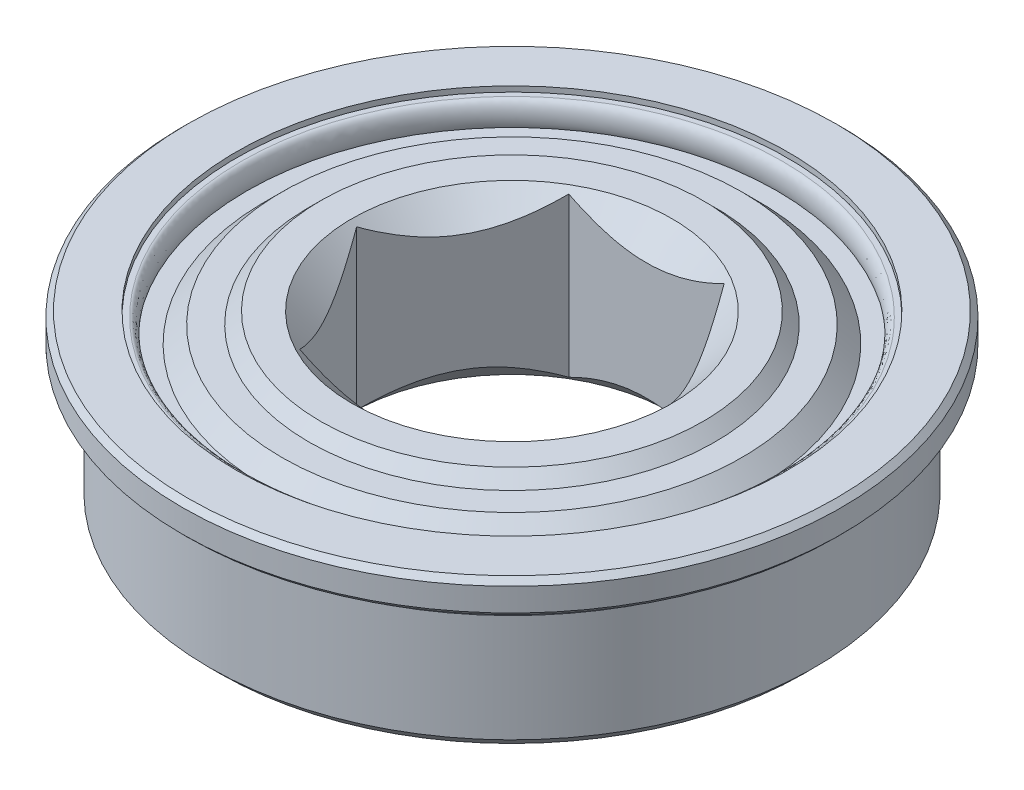
ISO-10303-21;
HEADER;
FILE_DESCRIPTION(('STEP AP214'),'2;1');
FILE_NAME('part.step','',(''),(''),'','','');
FILE_SCHEMA(('AUTOMOTIVE_DESIGN { 1 0 10303 214 1 1 1 1 }'));
ENDSEC;
DATA;
#1=APPLICATION_CONTEXT('core data for automotive mechanical design processes');
#2=APPLICATION_PROTOCOL_DEFINITION('international standard','automotive_design',2000,#1);
#3=PRODUCT_CONTEXT('',#1,'mechanical');
#4=PRODUCT('Part','Part','',(#3));
#5=PRODUCT_RELATED_PRODUCT_CATEGORY('part','',(#4));
#6=PRODUCT_DEFINITION_FORMATION('','',#4);
#7=PRODUCT_DEFINITION_CONTEXT('part definition',#1,'design');
#8=PRODUCT_DEFINITION('design','',#6,#7);
#9=PRODUCT_DEFINITION_SHAPE('','',#8);
#10=(LENGTH_UNIT() NAMED_UNIT(*) SI_UNIT(.MILLI.,.METRE.));
#11=(NAMED_UNIT(*) PLANE_ANGLE_UNIT() SI_UNIT($,.RADIAN.));
#12=(NAMED_UNIT(*) SI_UNIT($,.STERADIAN.) SOLID_ANGLE_UNIT());
#13=UNCERTAINTY_MEASURE_WITH_UNIT(LENGTH_MEASURE(1.E-05),#10,'distance_accuracy_value','');
#14=(GEOMETRIC_REPRESENTATION_CONTEXT(3) GLOBAL_UNCERTAINTY_ASSIGNED_CONTEXT((#13)) GLOBAL_UNIT_ASSIGNED_CONTEXT((#10,
#11,#12)) REPRESENTATION_CONTEXT('',''));
#15=CARTESIAN_POINT('',(0.,0.,0.));
#16=DIRECTION('',(0.,0.,1.));
#17=DIRECTION('',(1.,0.,0.));
#18=AXIS2_PLACEMENT_3D('',#15,#16,#17);
#19=CARTESIAN_POINT('',(0.,-1.7272,0.));
#20=DIRECTION('',(0.,-1.,0.));
#21=DIRECTION('',(0.,0.,-1.));
#22=AXIS2_PLACEMENT_3D('',#19,#20,#21);
#23=TOROIDAL_SURFACE('',#22,14.224,0.127);
#24=CARTESIAN_POINT('',(0.,-1.7272,0.));
#25=DIRECTION('',(0.,-1.,0.));
#26=DIRECTION('',(0.,0.,-1.));
#27=AXIS2_PLACEMENT_3D('',#24,#25,#26);
#28=CIRCLE('',#27,14.097);
#29=CARTESIAN_POINT('',(0.,-1.7272,-14.097));
#30=VERTEX_POINT('',#29);
#31=EDGE_CURVE('E424',#30,#30,#28,.T.);
#32=ORIENTED_EDGE('',*,*,#31,.F.);
#33=EDGE_LOOP('',(#32));
#34=FACE_BOUND('',#33,.T.);
#35=CARTESIAN_POINT('',(0.,-1.6002,0.));
#36=DIRECTION('',(0.,1.,0.));
#37=DIRECTION('',(0.,0.,-1.));
#38=AXIS2_PLACEMENT_3D('',#35,#36,#37);
#39=CIRCLE('',#38,14.224);
#40=CARTESIAN_POINT('',(0.,-1.6002,-14.224));
#41=VERTEX_POINT('',#40);
#42=EDGE_CURVE('E423',#41,#41,#39,.T.);
#43=ORIENTED_EDGE('',*,*,#42,.F.);
#44=EDGE_LOOP('',(#43));
#45=FACE_BOUND('',#44,.T.);
#46=ADVANCED_FACE('F16',(#34,#45),#23,.F.);
#47=CARTESIAN_POINT('',(7.33234841870825,-7.9375,0.));
#48=DIRECTION('',(0.866025403784439,0.,-0.5));
#49=DIRECTION('',(0.,-1.,0.));
#50=AXIS2_PLACEMENT_3D('',#47,#48,#49);
#51=PLANE('',#50);
#52=CARTESIAN_POINT('',(7.33234841870825,-0.22415158129175,0.));
#53=CARTESIAN_POINT('',(6.86885874856062,-0.68764125143938,-0.802787657479035));
#54=CARTESIAN_POINT('',(6.44960705918636,-0.928142123320571,-1.52895288463434));
#55=CARTESIAN_POINT('',(5.96795144312518,-1.20444058208666,-2.36320488340318));
#56=CARTESIAN_POINT('',(5.50600984993854,-1.2064856558471,-3.16331119293176));
#57=CARTESIAN_POINT('',(5.04374558814999,-1.20853215810218,-3.96397638087285));
#58=CARTESIAN_POINT('',(4.5611815986816,-0.935135019167009,-4.79980172853524));
#59=CARTESIAN_POINT('',(4.13662420852037,-0.694601580458219,-5.53515669902333));
#60=CARTESIAN_POINT('',(3.66617420935412,-0.224151581291739,-6.35000000000001));
#61=B_SPLINE_CURVE_WITH_KNOTS('',2,(#52,#53,#54,#55,#56,#57,#58,#59,#60),.UNSPECIFIED.,.F.,.F.,
(3,2,2,2,3),(0.,0.25,0.5,0.75,1.),.UNSPECIFIED.);
#62=CARTESIAN_POINT('',(7.33234841870825,-0.224151581291754,0.));
#63=VERTEX_POINT('',#62);
#64=CARTESIAN_POINT('',(3.66617420935412,-0.224151581291751,-6.35));
#65=VERTEX_POINT('',#64);
#66=EDGE_CURVE('E207',#63,#65,#61,.T.);
#67=ORIENTED_EDGE('',*,*,#66,.T.);
#68=DIRECTION('',(0.,1.,0.));
#69=VECTOR('',#68,1.);
#70=CARTESIAN_POINT('',(3.66617420935412,-7.9375,-6.35));
#71=LINE('',#70,#69);
#72=CARTESIAN_POINT('',(3.66617420935412,-7.71334841870825,-6.35));
#73=VERTEX_POINT('',#72);
#74=EDGE_CURVE('E11',#73,#65,#71,.T.);
#75=ORIENTED_EDGE('',*,*,#74,.F.);
#76=CARTESIAN_POINT('',(3.66617420935412,-7.71334841870824,-6.35000000000001));
#77=CARTESIAN_POINT('',(4.12966387950616,-7.24985874855621,-5.54721234251334));
#78=CARTESIAN_POINT('',(4.54891556887601,-7.00935787667942,-4.82104711536568));
#79=CARTESIAN_POINT('',(5.03057118494097,-6.73305941791331,-3.98679511659028));
#80=CARTESIAN_POINT('',(5.49251277812383,-6.73101434415289,-3.18668880706825));
#81=CARTESIAN_POINT('',(5.95477703991218,-6.72896784189781,-2.38602361912751));
#82=CARTESIAN_POINT('',(6.43734102938077,-7.00236498083298,-1.55019827146477));
#83=CARTESIAN_POINT('',(6.86189841954177,-7.24289841954153,-0.814843300977084));
#84=CARTESIAN_POINT('',(7.33234841870825,-7.71334841870824,0.));
#85=B_SPLINE_CURVE_WITH_KNOTS('',2,(#76,#77,#78,#79,#80,#81,#82,#83,#84),.UNSPECIFIED.,.F.,.F.,
(3,2,2,2,3),(0.,0.25,0.5,0.75,1.),.UNSPECIFIED.);
#86=CARTESIAN_POINT('',(7.33234841870825,-7.71334841870825,0.));
#87=VERTEX_POINT('',#86);
#88=EDGE_CURVE('E370',#73,#87,#85,.T.);
#89=ORIENTED_EDGE('',*,*,#88,.T.);
#90=DIRECTION('',(0.,1.,0.));
#91=VECTOR('',#90,1.);
#92=CARTESIAN_POINT('',(7.33234841870825,-7.9375,0.));
#93=LINE('',#92,#91);
#94=EDGE_CURVE('E188',#87,#63,#93,.T.);
#95=ORIENTED_EDGE('',*,*,#94,.T.);
#96=EDGE_LOOP('',(#67,#75,#89,#95));
#97=FACE_BOUND('',#96,.T.);
#98=ADVANCED_FACE('F615',(#97),#51,.F.);
#99=CARTESIAN_POINT('',(3.66617420935412,-7.9375,-6.35));
#100=DIRECTION('',(0.,0.,-1.));
#101=DIRECTION('',(-1.,0.,0.));
#102=AXIS2_PLACEMENT_3D('',#99,#100,#101);
#103=PLANE('',#102);
#104=CARTESIAN_POINT('',(3.66617420935412,-0.22415158129174,-6.35));
#105=CARTESIAN_POINT('',(2.73227432110119,-0.69110152541821,-6.35));
#106=CARTESIAN_POINT('',(1.88795550411408,-0.93178295053179,-6.35));
#107=CARTESIAN_POINT('',(0.925627723468545,-1.20610399728834,-6.35));
#108=CARTESIAN_POINT('',(0.00216765710562509,-1.20649963002069,-6.35));
#109=CARTESIAN_POINT('',(-0.92177943687831,-1.20689547140752,-6.35));
#110=CARTESIAN_POINT('',(-1.8867218260932,-0.93213442667476,-6.35));
#111=CARTESIAN_POINT('',(-2.7310323176977,-0.69172252711998,-6.35));
#112=CARTESIAN_POINT('',(-3.66617420935413,-0.22415158129174,-6.35));
#113=B_SPLINE_CURVE_WITH_KNOTS('',2,(#104,#105,#106,#107,#108,#109,#110,#111,#112),
.UNSPECIFIED.,.F.,.F.,(3,2,2,2,3),(0.,0.25,0.5,0.75,1.),.UNSPECIFIED.);
#114=CARTESIAN_POINT('',(-3.66617420935413,-0.224151581291746,-6.35));
#115=VERTEX_POINT('',#114);
#116=EDGE_CURVE('E564',#65,#115,#113,.T.);
#117=ORIENTED_EDGE('',*,*,#116,.T.);
#118=DIRECTION('',(0.,1.,0.));
#119=VECTOR('',#118,1.);
#120=CARTESIAN_POINT('',(-3.66617420935413,-7.9375,-6.35));
#121=LINE('',#120,#119);
#122=CARTESIAN_POINT('',(-3.66617420935413,-7.71334841870826,-6.35));
#123=VERTEX_POINT('',#122);
#124=EDGE_CURVE('E29',#123,#115,#121,.T.);
#125=ORIENTED_EDGE('',*,*,#124,.F.);
#126=CARTESIAN_POINT('',(-3.66617420935413,-7.71334841870825,-6.35));
#127=CARTESIAN_POINT('',(-2.73160048914318,-7.24606155860275,-6.35));
#128=CARTESIAN_POINT('',(-1.8867218260932,-7.00536557332522,-6.35));
#129=CARTESIAN_POINT('',(-0.9228354387176,-6.73076568833412,-6.35));
#130=CARTESIAN_POINT('',(0.00216765710562986,-6.73100036997929,-6.35));
#131=CARTESIAN_POINT('',(0.92456619557612,-6.73123439082472,-6.35));
#132=CARTESIAN_POINT('',(1.88795550411408,-7.0057170494682,-6.35));
#133=CARTESIAN_POINT('',(2.73169984620938,-7.24611123713587,-6.35));
#134=CARTESIAN_POINT('',(3.66617420935412,-7.71334841870824,-6.35));
#135=B_SPLINE_CURVE_WITH_KNOTS('',2,(#126,#127,#128,#129,#130,#131,#132,#133,#134),
.UNSPECIFIED.,.F.,.F.,(3,2,2,2,3),(0.,0.25,0.5,0.75,1.),.UNSPECIFIED.);
#136=EDGE_CURVE('E378',#123,#73,#135,.T.);
#137=ORIENTED_EDGE('',*,*,#136,.T.);
#138=ORIENTED_EDGE('',*,*,#74,.T.);
#139=EDGE_LOOP('',(#117,#125,#137,#138));
#140=FACE_BOUND('',#139,.T.);
#141=ADVANCED_FACE('F476',(#140),#103,.F.);
#142=CARTESIAN_POINT('',(-3.66617420935413,-7.9375,-6.35));
#143=DIRECTION('',(-0.866025403784439,0.,-0.5));
#144=DIRECTION('',(-0.5,0.,0.866025403784439));
#145=AXIS2_PLACEMENT_3D('',#142,#143,#144);
#146=PLANE('',#145);
#147=CARTESIAN_POINT('',(-3.66617420935413,-0.224151581291737,-6.35));
#148=CARTESIAN_POINT('',(-4.12966387950116,-0.687641251438776,-5.54721234252199));
#149=CARTESIAN_POINT('',(-4.54891556887602,-0.928142123320557,-4.82104711536567));
#150=CARTESIAN_POINT('',(-5.03057118493667,-1.20444058208665,-3.98679511659772));
#151=CARTESIAN_POINT('',(-5.49251277812383,-1.20648565584709,-3.18668880706824));
#152=CARTESIAN_POINT('',(-5.95477703991238,-1.20853215810217,-2.38602361912716));
#153=CARTESIAN_POINT('',(-6.43734102938078,-0.935135019166996,-1.55019827146476));
#154=CARTESIAN_POINT('',(-6.861898419542,-0.694601580458217,-0.814843300976677));
#155=CARTESIAN_POINT('',(-7.33234841870825,-0.224151581291737,0.));
#156=B_SPLINE_CURVE_WITH_KNOTS('',2,(#147,#148,#149,#150,#151,#152,#153,#154,#155),
.UNSPECIFIED.,.F.,.F.,(3,2,2,2,3),(0.,0.25,0.5,0.75,1.),.UNSPECIFIED.);
#157=CARTESIAN_POINT('',(-7.33234841870825,-0.224151581291749,0.));
#158=VERTEX_POINT('',#157);
#159=EDGE_CURVE('E559',#115,#158,#156,.T.);
#160=ORIENTED_EDGE('',*,*,#159,.T.);
#161=DIRECTION('',(0.,1.,0.));
#162=VECTOR('',#161,1.);
#163=CARTESIAN_POINT('',(-7.33234841870825,-7.9375,0.));
#164=LINE('',#163,#162);
#165=CARTESIAN_POINT('',(-7.33234841870825,-7.71334841870825,0.));
#166=VERTEX_POINT('',#165);
#167=EDGE_CURVE('E305',#166,#158,#164,.T.);
#168=ORIENTED_EDGE('',*,*,#167,.F.);
#169=CARTESIAN_POINT('',(-7.33234841870825,-7.71334841870825,0.));
#170=CARTESIAN_POINT('',(-6.86885874856335,-7.24985874856334,-0.80278765747431));
#171=CARTESIAN_POINT('',(-6.44960705918636,-7.00935787667942,-1.52895288463433));
#172=CARTESIAN_POINT('',(-5.96795144312366,-6.73305941791111,-2.36320488340584));
#173=CARTESIAN_POINT('',(-5.50600984993855,-6.7310143441529,-3.16331119293176));
#174=CARTESIAN_POINT('',(-5.0437455881457,-6.72896784190002,-3.9639763808803));
#175=CARTESIAN_POINT('',(-4.56118159868161,-7.00236498083299,-4.79980172853523));
#176=CARTESIAN_POINT('',(-4.13662420851991,-7.24289841954224,-5.53515669902414));
#177=CARTESIAN_POINT('',(-3.66617420935413,-7.71334841870825,-6.35));
#178=B_SPLINE_CURVE_WITH_KNOTS('',2,(#169,#170,#171,#172,#173,#174,#175,#176,#177),
.UNSPECIFIED.,.F.,.F.,(3,2,2,2,3),(0.,0.25,0.5,0.75,1.),.UNSPECIFIED.);
#179=EDGE_CURVE('E649',#166,#123,#178,.T.);
#180=ORIENTED_EDGE('',*,*,#179,.T.);
#181=ORIENTED_EDGE('',*,*,#124,.T.);
#182=EDGE_LOOP('',(#160,#168,#180,#181));
#183=FACE_BOUND('',#182,.T.);
#184=ADVANCED_FACE('F278',(#183),#146,.F.);
#185=CARTESIAN_POINT('',(-7.33234841870825,-7.9375,0.));
#186=DIRECTION('',(-0.866025403784439,0.,0.5));
#187=DIRECTION('',(0.,1.,0.));
#188=AXIS2_PLACEMENT_3D('',#185,#186,#187);
#189=PLANE('',#188);
#190=CARTESIAN_POINT('',(-7.33234841870825,-0.22415158129174,0.));
#191=CARTESIAN_POINT('',(-6.86885874856026,-0.68764125143973,0.802787657479657));
#192=CARTESIAN_POINT('',(-6.44960705918636,-0.928142123320571,1.52895288463434));
#193=CARTESIAN_POINT('',(-5.96795144312488,-1.20444058208666,2.36320488340372));
#194=CARTESIAN_POINT('',(-5.50600984993854,-1.20648565584709,3.16331119293176));
#195=CARTESIAN_POINT('',(-5.04374558815039,-1.20853215810217,3.96397638087217));
#196=CARTESIAN_POINT('',(-4.5611815986816,-0.935135019167,4.79980172853524));
#197=CARTESIAN_POINT('',(-4.13662420852084,-0.69460158045868,5.53515669902252));
#198=CARTESIAN_POINT('',(-3.66617420935413,-0.22415158129174,6.35));
#199=B_SPLINE_CURVE_WITH_KNOTS('',2,(#190,#191,#192,#193,#194,#195,#196,#197,#198),
.UNSPECIFIED.,.F.,.F.,(3,2,2,2,3),(0.,0.25,0.5,0.75,1.),.UNSPECIFIED.);
#200=CARTESIAN_POINT('',(-3.66617420935413,-0.224151581291752,6.35));
#201=VERTEX_POINT('',#200);
#202=EDGE_CURVE('E264',#158,#201,#199,.T.);
#203=ORIENTED_EDGE('',*,*,#202,.T.);
#204=DIRECTION('',(0.,1.,0.));
#205=VECTOR('',#204,1.);
#206=CARTESIAN_POINT('',(-3.66617420935413,-7.9375,6.35));
#207=LINE('',#206,#205);
#208=CARTESIAN_POINT('',(-3.66617420935413,-7.71334841870825,6.35));
#209=VERTEX_POINT('',#208);
#210=EDGE_CURVE('E187',#209,#201,#207,.T.);
#211=ORIENTED_EDGE('',*,*,#210,.F.);
#212=CARTESIAN_POINT('',(-3.66617420935412,-7.71334841870824,6.35));
#213=CARTESIAN_POINT('',(-4.12966387951137,-7.249858748551,5.54721234250431));
#214=CARTESIAN_POINT('',(-4.54891556887601,-7.00935787667942,4.82104711536567));
#215=CARTESIAN_POINT('',(-5.03057118494938,-6.73305941791106,3.9867951165757));
#216=CARTESIAN_POINT('',(-5.49251277812383,-6.7310143441529,3.18668880706825));
#217=CARTESIAN_POINT('',(-5.95477703991627,-6.72896784190002,2.38602361912041));
#218=CARTESIAN_POINT('',(-6.43734102938077,-7.00236498083299,1.55019827146477));
#219=CARTESIAN_POINT('',(-6.861898419542,-7.24289841954177,0.814843300976686));
#220=CARTESIAN_POINT('',(-7.33234841870825,-7.71334841870825,0.));
#221=B_SPLINE_CURVE_WITH_KNOTS('',2,(#212,#213,#214,#215,#216,#217,#218,#219,#220),
.UNSPECIFIED.,.F.,.F.,(3,2,2,2,3),(0.,0.25,0.5,0.75,1.),.UNSPECIFIED.);
#222=EDGE_CURVE('E300',#209,#166,#221,.T.);
#223=ORIENTED_EDGE('',*,*,#222,.T.);
#224=ORIENTED_EDGE('',*,*,#167,.T.);
#225=EDGE_LOOP('',(#203,#211,#223,#224));
#226=FACE_BOUND('',#225,.T.);
#227=ADVANCED_FACE('F268',(#226),#189,.F.);
#228=CARTESIAN_POINT('',(-3.66617420935413,-7.9375,6.35));
#229=DIRECTION('',(0.,0.,1.));
#230=DIRECTION('',(0.,-1.,0.));
#231=AXIS2_PLACEMENT_3D('',#228,#229,#230);
#232=PLANE('',#231);
#233=CARTESIAN_POINT('',(-3.66617420935413,-0.22415158129174,6.35));
#234=CARTESIAN_POINT('',(-2.73160048914295,-0.69143844139736,6.35));
#235=CARTESIAN_POINT('',(-1.8867218260932,-0.93213442667477,6.35));
#236=CARTESIAN_POINT('',(-0.922835438717395,-1.20673431166587,6.35));
#237=CARTESIAN_POINT('',(0.00216765710562509,-1.2064996300207,6.35));
#238=CARTESIAN_POINT('',(0.924566195573501,-1.20626560917527,6.35));
#239=CARTESIAN_POINT('',(1.88795550411409,-0.93178295053179,6.35));
#240=CARTESIAN_POINT('',(2.73169984620637,-0.691388762865629,6.35));
#241=CARTESIAN_POINT('',(3.66617420935412,-0.22415158129174,6.35));
#242=B_SPLINE_CURVE_WITH_KNOTS('',2,(#233,#234,#235,#236,#237,#238,#239,#240,#241),
.UNSPECIFIED.,.F.,.F.,(3,2,2,2,3),(0.,0.25,0.5,0.75,1.),.UNSPECIFIED.);
#243=CARTESIAN_POINT('',(3.66617420935412,-0.224151581291752,6.35));
#244=VERTEX_POINT('',#243);
#245=EDGE_CURVE('E191',#201,#244,#242,.T.);
#246=ORIENTED_EDGE('',*,*,#245,.T.);
#247=DIRECTION('',(0.,1.,0.));
#248=VECTOR('',#247,1.);
#249=CARTESIAN_POINT('',(3.66617420935412,-7.9375,6.35));
#250=LINE('',#249,#248);
#251=CARTESIAN_POINT('',(3.66617420935412,-7.71334841870825,6.35));
#252=VERTEX_POINT('',#251);
#253=EDGE_CURVE('E173',#252,#244,#250,.T.);
#254=ORIENTED_EDGE('',*,*,#253,.F.);
#255=CARTESIAN_POINT('',(3.66617420935412,-7.71334841870824,6.35));
#256=CARTESIAN_POINT('',(2.73227432109839,-7.24639847458037,6.35));
#257=CARTESIAN_POINT('',(1.88795550411409,-7.0057170494682,6.35));
#258=CARTESIAN_POINT('',(0.92562772346614,-6.73139600271165,6.35));
#259=CARTESIAN_POINT('',(0.00216765710562509,-6.73100036997929,6.35));
#260=CARTESIAN_POINT('',(-0.92177943688398,-6.73060452859247,6.35));
#261=CARTESIAN_POINT('',(-1.8867218260932,-7.00536557332522,6.35));
#262=CARTESIAN_POINT('',(-2.73103231770423,-7.24577747288327,6.35));
#263=CARTESIAN_POINT('',(-3.66617420935413,-7.71334841870824,6.35));
#264=B_SPLINE_CURVE_WITH_KNOTS('',2,(#255,#256,#257,#258,#259,#260,#261,#262,#263),
.UNSPECIFIED.,.F.,.F.,(3,2,2,2,3),(0.,0.25,0.5,0.75,1.),.UNSPECIFIED.);
#265=EDGE_CURVE('E371',#252,#209,#264,.T.);
#266=ORIENTED_EDGE('',*,*,#265,.T.);
#267=ORIENTED_EDGE('',*,*,#210,.T.);
#268=EDGE_LOOP('',(#246,#254,#266,#267));
#269=FACE_BOUND('',#268,.T.);
#270=ADVANCED_FACE('F193',(#269),#232,.F.);
#271=CARTESIAN_POINT('',(3.66617420935412,-7.9375,6.35));
#272=DIRECTION('',(0.866025403784439,0.,0.5));
#273=DIRECTION('',(0.,-1.,0.));
#274=AXIS2_PLACEMENT_3D('',#271,#272,#273);
#275=PLANE('',#274);
#276=CARTESIAN_POINT('',(3.66617420935413,-0.22415158129174,6.35));
#277=CARTESIAN_POINT('',(4.12966387950282,-0.68764125144044,5.54721234251911));
#278=CARTESIAN_POINT('',(4.54891556887602,-0.928142123320571,4.82104711536566));
#279=CARTESIAN_POINT('',(5.0305711849368,-1.20444058208591,3.98679511659749));
#280=CARTESIAN_POINT('',(5.49251277812383,-1.2064856558471,3.18668880706824));
#281=CARTESIAN_POINT('',(5.95477703991108,-1.20853215810292,2.38602361912941));
#282=CARTESIAN_POINT('',(6.43734102938078,-0.935135019167009,1.55019827146476));
#283=CARTESIAN_POINT('',(6.861898419542,-0.694601580458219,0.814843300976678));
#284=CARTESIAN_POINT('',(7.33234841870825,-0.224151581291749,0.));
#285=B_SPLINE_CURVE_WITH_KNOTS('',2,(#276,#277,#278,#279,#280,#281,#282,#283,#284),
.UNSPECIFIED.,.F.,.F.,(3,2,2,2,3),(0.,0.25,0.5,0.75,1.),.UNSPECIFIED.);
#286=EDGE_CURVE('E177',#244,#63,#285,.T.);
#287=ORIENTED_EDGE('',*,*,#286,.T.);
#288=ORIENTED_EDGE('',*,*,#94,.F.);
#289=CARTESIAN_POINT('',(7.33234841870825,-7.71334841870824,0.));
#290=CARTESIAN_POINT('',(6.86885874856263,-7.24985874856263,0.802787657475541));
#291=CARTESIAN_POINT('',(6.44960705918636,-7.00935787667942,1.52895288463433));
#292=CARTESIAN_POINT('',(5.96795144312693,-6.73305941791334,2.36320488340015));
#293=CARTESIAN_POINT('',(5.50600984993855,-6.73101434415289,3.16331119293175));
#294=CARTESIAN_POINT('',(5.04374558814941,-6.72896784189781,3.96397638087386));
#295=CARTESIAN_POINT('',(4.5611815986816,-7.00236498083298,4.79980172853523));
#296=CARTESIAN_POINT('',(4.13662420851969,-7.24289841954246,5.53515669902451));
#297=CARTESIAN_POINT('',(3.66617420935412,-7.71334841870824,6.35));
#298=B_SPLINE_CURVE_WITH_KNOTS('',2,(#289,#290,#291,#292,#293,#294,#295,#296,#297),
.UNSPECIFIED.,.F.,.F.,(3,2,2,2,3),(0.,0.25,0.5,0.75,1.),.UNSPECIFIED.);
#299=EDGE_CURVE('E181',#87,#252,#298,.T.);
#300=ORIENTED_EDGE('',*,*,#299,.T.);
#301=ORIENTED_EDGE('',*,*,#253,.T.);
#302=EDGE_LOOP('',(#287,#288,#300,#301));
#303=FACE_BOUND('',#302,.T.);
#304=ADVANCED_FACE('F175',(#303),#275,.F.);
#305=CARTESIAN_POINT('',(0.,-6.5913,0.));
#306=DIRECTION('',(0.,-1.,0.));
#307=DIRECTION('',(0.,0.,-1.));
#308=AXIS2_PLACEMENT_3D('',#305,#306,#307);
#309=PLANE('',#308);
#310=CARTESIAN_POINT('',(0.,-6.5913,0.));
#311=DIRECTION('',(0.,1.,0.));
#312=DIRECTION('',(0.,0.,1.));
#313=AXIS2_PLACEMENT_3D('',#310,#311,#312);
#314=CIRCLE('',#313,11.6447517727908);
#315=CARTESIAN_POINT('',(0.,-6.5913,11.6447517727908));
#316=VERTEX_POINT('',#315);
#317=EDGE_CURVE('E42',#316,#316,#314,.T.);
#318=ORIENTED_EDGE('',*,*,#317,.T.);
#319=EDGE_LOOP('',(#318));
#320=FACE_BOUND('',#319,.T.);
#321=CARTESIAN_POINT('',(0.,-6.5913,0.));
#322=DIRECTION('',(0.,1.,0.));
#323=DIRECTION('',(0.,0.,1.));
#324=AXIS2_PLACEMENT_3D('',#321,#322,#323);
#325=CIRCLE('',#324,12.5150539573705);
#326=CARTESIAN_POINT('',(0.,-6.5913,12.5150539573705));
#327=VERTEX_POINT('',#326);
#328=EDGE_CURVE('E393',#327,#327,#325,.T.);
#329=ORIENTED_EDGE('',*,*,#328,.F.);
#330=EDGE_LOOP('',(#329));
#331=FACE_BOUND('',#330,.T.);
#332=ADVANCED_FACE('F316',(#320,#331),#309,.T.);
#333=CARTESIAN_POINT('',(0.,-6.5913,0.));
#334=DIRECTION('',(0.,1.,0.));
#335=DIRECTION('',(0.,0.,1.));
#336=AXIS2_PLACEMENT_3D('',#333,#334,#335);
#337=CONICAL_SURFACE('',#336,11.6447517727908,0.78539816339745);
#338=CARTESIAN_POINT('',(0.,-7.37755177279077,0.));
#339=DIRECTION('',(0.,1.,0.));
#340=DIRECTION('',(0.,0.,1.));
#341=AXIS2_PLACEMENT_3D('',#338,#339,#340);
#342=CIRCLE('',#341,10.8585);
#343=CARTESIAN_POINT('',(0.,-7.37755177279077,10.8585));
#344=VERTEX_POINT('',#343);
#345=EDGE_CURVE('E407',#344,#344,#342,.T.);
#346=ORIENTED_EDGE('',*,*,#345,.T.);
#347=EDGE_LOOP('',(#346));
#348=FACE_BOUND('',#347,.T.);
#349=ORIENTED_EDGE('',*,*,#317,.F.);
#350=EDGE_LOOP('',(#349));
#351=FACE_BOUND('',#350,.T.);
#352=ADVANCED_FACE('F510',(#348,#351),#337,.T.);
#353=CARTESIAN_POINT('',(0.,-7.37755177279077,0.));
#354=DIRECTION('',(0.,-1.,0.));
#355=DIRECTION('',(0.,0.,-1.));
#356=AXIS2_PLACEMENT_3D('',#353,#354,#355);
#357=PLANE('',#356);
#358=CARTESIAN_POINT('',(0.,-7.37755177279077,0.));
#359=DIRECTION('',(0.,1.,0.));
#360=DIRECTION('',(0.,0.,1.));
#361=AXIS2_PLACEMENT_3D('',#358,#359,#360);
#362=CIRCLE('',#361,9.5885);
#363=CARTESIAN_POINT('',(0.,-7.37755177279077,9.5885));
#364=VERTEX_POINT('',#363);
#365=EDGE_CURVE('E403',#364,#364,#362,.T.);
#366=ORIENTED_EDGE('',*,*,#365,.T.);
#367=EDGE_LOOP('',(#366));
#368=FACE_BOUND('',#367,.T.);
#369=ORIENTED_EDGE('',*,*,#345,.F.);
#370=EDGE_LOOP('',(#369));
#371=FACE_BOUND('',#370,.T.);
#372=ADVANCED_FACE('F506',(#368,#371),#357,.T.);
#373=CARTESIAN_POINT('',(0.,-7.37755177279077,0.));
#374=DIRECTION('',(0.,1.,0.));
#375=DIRECTION('',(0.,0.,1.));
#376=AXIS2_PLACEMENT_3D('',#373,#374,#375);
#377=CONICAL_SURFACE('',#376,9.5885,0.785398163397456);
#378=CARTESIAN_POINT('',(0.,-7.9375,0.));
#379=DIRECTION('',(0.,1.,0.));
#380=DIRECTION('',(0.,0.,1.));
#381=AXIS2_PLACEMENT_3D('',#378,#379,#380);
#382=CIRCLE('',#381,9.02855177279076);
#383=CARTESIAN_POINT('',(0.,-7.9375,9.02855177279076));
#384=VERTEX_POINT('',#383);
#385=EDGE_CURVE('E408',#384,#384,#382,.T.);
#386=ORIENTED_EDGE('',*,*,#385,.T.);
#387=EDGE_LOOP('',(#386));
#388=FACE_BOUND('',#387,.T.);
#389=ORIENTED_EDGE('',*,*,#365,.F.);
#390=EDGE_LOOP('',(#389));
#391=FACE_BOUND('',#390,.T.);
#392=ADVANCED_FACE('F509',(#388,#391),#377,.T.);
#393=CARTESIAN_POINT('',(0.,-7.9375,0.));
#394=DIRECTION('',(0.,1.,0.));
#395=DIRECTION('',(0.,0.,-1.));
#396=AXIS2_PLACEMENT_3D('',#393,#394,#395);
#397=PLANE('',#396);
#398=CARTESIAN_POINT('',(0.,-7.9375,0.));
#399=DIRECTION('',(0.,1.,0.));
#400=DIRECTION('',(0.,0.,1.));
#401=AXIS2_PLACEMENT_3D('',#398,#399,#400);
#402=CIRCLE('',#401,7.5565);
#403=CARTESIAN_POINT('',(0.,-7.9375,7.5565));
#404=VERTEX_POINT('',#403);
#405=EDGE_CURVE('E199',#404,#404,#402,.T.);
#406=ORIENTED_EDGE('',*,*,#405,.T.);
#407=EDGE_LOOP('',(#406));
#408=FACE_BOUND('',#407,.T.);
#409=ORIENTED_EDGE('',*,*,#385,.F.);
#410=EDGE_LOOP('',(#409));
#411=FACE_BOUND('',#410,.T.);
#412=ADVANCED_FACE('F315',(#408,#411),#397,.F.);
#413=CARTESIAN_POINT('',(0.,-7.9375,0.));
#414=DIRECTION('',(0.,-1.,0.));
#415=DIRECTION('',(0.,0.,-1.));
#416=AXIS2_PLACEMENT_3D('',#413,#414,#415);
#417=CONICAL_SURFACE('',#416,7.5565,0.785398163397446);
#418=ORIENTED_EDGE('',*,*,#299,.F.);
#419=ORIENTED_EDGE('',*,*,#88,.F.);
#420=ORIENTED_EDGE('',*,*,#136,.F.);
#421=ORIENTED_EDGE('',*,*,#179,.F.);
#422=ORIENTED_EDGE('',*,*,#222,.F.);
#423=ORIENTED_EDGE('',*,*,#265,.F.);
#424=EDGE_LOOP('',(#418,#419,#420,#421,#422,#423));
#425=FACE_BOUND('',#424,.T.);
#426=ORIENTED_EDGE('',*,*,#405,.F.);
#427=EDGE_LOOP('',(#426));
#428=FACE_BOUND('',#427,.T.);
#429=ADVANCED_FACE('F228',(#425,#428),#417,.F.);
#430=CARTESIAN_POINT('',(0.,-1.2065,0.));
#431=DIRECTION('',(0.,1.,0.));
#432=DIRECTION('',(0.,0.,1.));
#433=AXIS2_PLACEMENT_3D('',#430,#431,#432);
#434=CONICAL_SURFACE('',#433,6.35,0.785398163397448);
#435=ORIENTED_EDGE('',*,*,#202,.F.);
#436=ORIENTED_EDGE('',*,*,#159,.F.);
#437=ORIENTED_EDGE('',*,*,#116,.F.);
#438=ORIENTED_EDGE('',*,*,#66,.F.);
#439=ORIENTED_EDGE('',*,*,#286,.F.);
#440=ORIENTED_EDGE('',*,*,#245,.F.);
#441=EDGE_LOOP('',(#435,#436,#437,#438,#439,#440));
#442=FACE_BOUND('',#441,.T.);
#443=CARTESIAN_POINT('',(0.,0.,0.));
#444=DIRECTION('',(0.,1.,0.));
#445=DIRECTION('',(0.,0.,1.));
#446=AXIS2_PLACEMENT_3D('',#443,#444,#445);
#447=CIRCLE('',#446,7.5565);
#448=CARTESIAN_POINT('',(0.,0.,7.5565));
#449=VERTEX_POINT('',#448);
#450=EDGE_CURVE('E386',#449,#449,#447,.T.);
#451=ORIENTED_EDGE('',*,*,#450,.T.);
#452=EDGE_LOOP('',(#451));
#453=FACE_BOUND('',#452,.T.);
#454=ADVANCED_FACE('F203',(#442,#453),#434,.F.);
#455=CARTESIAN_POINT('',(0.,0.,0.));
#456=DIRECTION('',(0.,1.,0.));
#457=DIRECTION('',(0.,0.,-1.));
#458=AXIS2_PLACEMENT_3D('',#455,#456,#457);
#459=PLANE('',#458);
#460=ORIENTED_EDGE('',*,*,#450,.F.);
#461=EDGE_LOOP('',(#460));
#462=FACE_BOUND('',#461,.T.);
#463=CARTESIAN_POINT('',(0.,0.,0.));
#464=DIRECTION('',(0.,1.,0.));
#465=DIRECTION('',(0.,0.,1.));
#466=AXIS2_PLACEMENT_3D('',#463,#464,#465);
#467=CIRCLE('',#466,9.02855177279076);
#468=CARTESIAN_POINT('',(0.,0.,9.02855177279076));
#469=VERTEX_POINT('',#468);
#470=EDGE_CURVE('E434',#469,#469,#467,.T.);
#471=ORIENTED_EDGE('',*,*,#470,.T.);
#472=EDGE_LOOP('',(#471));
#473=FACE_BOUND('',#472,.T.);
#474=ADVANCED_FACE('F227',(#462,#473),#459,.T.);
#475=CARTESIAN_POINT('',(0.,-0.559948227209232,0.));
#476=DIRECTION('',(0.,-1.,0.));
#477=DIRECTION('',(0.,0.,-1.));
#478=AXIS2_PLACEMENT_3D('',#475,#476,#477);
#479=CONICAL_SURFACE('',#478,9.5885,0.785398163397453);
#480=ORIENTED_EDGE('',*,*,#470,.F.);
#481=EDGE_LOOP('',(#480));
#482=FACE_BOUND('',#481,.T.);
#483=CARTESIAN_POINT('',(0.,-0.559948227209232,0.));
#484=DIRECTION('',(0.,1.,0.));
#485=DIRECTION('',(0.,0.,1.));
#486=AXIS2_PLACEMENT_3D('',#483,#484,#485);
#487=CIRCLE('',#486,9.5885);
#488=CARTESIAN_POINT('',(0.,-0.559948227209233,9.5885));
#489=VERTEX_POINT('',#488);
#490=EDGE_CURVE('E431',#489,#489,#487,.T.);
#491=ORIENTED_EDGE('',*,*,#490,.T.);
#492=EDGE_LOOP('',(#491));
#493=FACE_BOUND('',#492,.T.);
#494=ADVANCED_FACE('F489',(#482,#493),#479,.T.);
#495=CARTESIAN_POINT('',(0.,-0.559948227209233,0.));
#496=DIRECTION('',(0.,-1.,0.));
#497=DIRECTION('',(0.,0.,-1.));
#498=AXIS2_PLACEMENT_3D('',#495,#496,#497);
#499=PLANE('',#498);
#500=ORIENTED_EDGE('',*,*,#490,.F.);
#501=EDGE_LOOP('',(#500));
#502=FACE_BOUND('',#501,.T.);
#503=CARTESIAN_POINT('',(0.,-0.559948227209233,0.));
#504=DIRECTION('',(0.,1.,0.));
#505=DIRECTION('',(0.,0.,1.));
#506=AXIS2_PLACEMENT_3D('',#503,#504,#505);
#507=CIRCLE('',#506,10.8585);
#508=CARTESIAN_POINT('',(0.,-0.559948227209234,10.8585));
#509=VERTEX_POINT('',#508);
#510=EDGE_CURVE('E402',#509,#509,#507,.T.);
#511=ORIENTED_EDGE('',*,*,#510,.T.);
#512=EDGE_LOOP('',(#511));
#513=FACE_BOUND('',#512,.T.);
#514=ADVANCED_FACE('F531',(#502,#513),#499,.F.);
#515=CARTESIAN_POINT('',(0.,-1.3462,0.));
#516=DIRECTION('',(0.,-1.,0.));
#517=DIRECTION('',(0.,0.,-1.));
#518=AXIS2_PLACEMENT_3D('',#515,#516,#517);
#519=CONICAL_SURFACE('',#518,11.6447517727908,0.785398163397448);
#520=ORIENTED_EDGE('',*,*,#510,.F.);
#521=EDGE_LOOP('',(#520));
#522=FACE_BOUND('',#521,.T.);
#523=CARTESIAN_POINT('',(0.,-1.3462,0.));
#524=DIRECTION('',(0.,1.,0.));
#525=DIRECTION('',(0.,0.,1.));
#526=AXIS2_PLACEMENT_3D('',#523,#524,#525);
#527=CIRCLE('',#526,11.6447517727908);
#528=CARTESIAN_POINT('',(0.,-1.3462,11.6447517727908));
#529=VERTEX_POINT('',#528);
#530=EDGE_CURVE('E399',#529,#529,#527,.T.);
#531=ORIENTED_EDGE('',*,*,#530,.T.);
#532=EDGE_LOOP('',(#531));
#533=FACE_BOUND('',#532,.T.);
#534=ADVANCED_FACE('F504',(#522,#533),#519,.T.);
#535=CARTESIAN_POINT('',(0.,-1.3462,0.));
#536=DIRECTION('',(0.,-1.,0.));
#537=DIRECTION('',(0.,0.,-1.));
#538=AXIS2_PLACEMENT_3D('',#535,#536,#537);
#539=PLANE('',#538);
#540=ORIENTED_EDGE('',*,*,#530,.F.);
#541=EDGE_LOOP('',(#540));
#542=FACE_BOUND('',#541,.T.);
#543=CARTESIAN_POINT('',(0.,-1.3462,0.));
#544=DIRECTION('',(0.,1.,0.));
#545=DIRECTION('',(0.,0.,1.));
#546=AXIS2_PLACEMENT_3D('',#543,#544,#545);
#547=CIRCLE('',#546,12.5150539573705);
#548=CARTESIAN_POINT('',(0.,-1.3462,12.5150539573705));
#549=VERTEX_POINT('',#548);
#550=EDGE_CURVE('E391',#549,#549,#547,.T.);
#551=ORIENTED_EDGE('',*,*,#550,.T.);
#552=EDGE_LOOP('',(#551));
#553=FACE_BOUND('',#552,.T.);
#554=ADVANCED_FACE('F500',(#542,#553),#539,.F.);
#555=CARTESIAN_POINT('',(0.,-0.254,-12.7635));
#556=CARTESIAN_POINT('',(-25.527,-0.254,-12.7635));
#557=CARTESIAN_POINT('',(-25.527,-0.254000000000003,12.7635));
#558=CARTESIAN_POINT('',(0.,-0.254,12.7635));
#559=CARTESIAN_POINT('',(25.527,-0.254000000000003,12.7635));
#560=CARTESIAN_POINT('',(25.527,-0.254,-12.7635));
#561=CARTESIAN_POINT('',(0.,-0.254,-12.7635));
#562=CARTESIAN_POINT('',(0.,-0.253999999999996,-12.4574304717335));
#563=CARTESIAN_POINT('',(-24.9148609434669,-0.253999999999997,-12.4574304717335));
#564=CARTESIAN_POINT('',(-24.9148609434669,-0.254,12.4574304717335));
#565=CARTESIAN_POINT('',(0.,-0.253999999999999,12.4574304717335));
#566=CARTESIAN_POINT('',(24.9148609434669,-0.254,12.4574304717335));
#567=CARTESIAN_POINT('',(24.9148609434669,-0.253999999999997,-12.4574304717335));
#568=CARTESIAN_POINT('',(0.,-0.253999999999996,-12.4574304717335));
#569=CARTESIAN_POINT('',(0.,-0.838456574164817,-12.3244823642989));
#570=CARTESIAN_POINT('',(-24.6489647285978,-0.838456574164818,-12.3244823642989));
#571=CARTESIAN_POINT('',(-24.6489647285978,-0.83845657416482,12.3244823642989));
#572=CARTESIAN_POINT('',(0.,-0.83845657416482,12.3244823642989));
#573=CARTESIAN_POINT('',(24.6489647285978,-0.83845657416482,12.3244823642989));
#574=CARTESIAN_POINT('',(24.6489647285978,-0.838456574164818,-12.3244823642989));
#575=CARTESIAN_POINT('',(0.,-0.838456574164817,-12.3244823642989));
#576=CARTESIAN_POINT('',(0.,-1.3462,-12.5150539573705));
#577=CARTESIAN_POINT('',(-25.030107914741,-1.3462,-12.5150539573705));
#578=CARTESIAN_POINT('',(-25.030107914741,-1.3462,12.5150539573705));
#579=CARTESIAN_POINT('',(0.,-1.3462,12.5150539573705));
#580=CARTESIAN_POINT('',(25.030107914741,-1.3462,12.5150539573705));
#581=CARTESIAN_POINT('',(25.030107914741,-1.3462,-12.5150539573705));
#582=CARTESIAN_POINT('',(0.,-1.3462,-12.5150539573705));
#583=(BOUNDED_SURFACE() B_SPLINE_SURFACE(3,3,((#555,#556,#557,#558,#559,#560,#561),(#562,#563,
#564,#565,#566,#567,#568),(#569,#570,#571,#572,#573,#574,#575),(#576,#577,#578,#579,#580,#581,
#582)),.UNSPECIFIED.,.F.,.T.,.F.) B_SPLINE_SURFACE_WITH_KNOTS((4,4),(4,3,4),(0.,1.),(0.,0.5,1.),
.UNSPECIFIED.) GEOMETRIC_REPRESENTATION_ITEM() RATIONAL_B_SPLINE_SURFACE(((1.,0.333333333333334,
0.333333333333334,1.,0.333333333333334,0.333333333333334,1.),(0.62291482850871,0.20763827616957,
0.20763827616957,0.62291482850871,0.20763827616957,0.20763827616957,0.62291482850871),
(0.62291482850871,0.20763827616957,0.20763827616957,0.62291482850871,0.20763827616957,
0.20763827616957,0.62291482850871),(1.,0.333333333333334,0.333333333333334,1.,0.333333333333334,
0.333333333333334,1.))) REPRESENTATION_ITEM('') SURFACE());
#584=CARTESIAN_POINT('',(0.,-0.254,0.));
#585=DIRECTION('',(0.,1.,0.));
#586=DIRECTION('',(0.,0.,1.));
#587=AXIS2_PLACEMENT_3D('',#584,#585,#586);
#588=CIRCLE('',#587,12.7635);
#589=CARTESIAN_POINT('',(0.,-0.254,12.7635));
#590=VERTEX_POINT('',#589);
#591=EDGE_CURVE('E388',#590,#590,#588,.T.);
#592=ORIENTED_EDGE('',*,*,#550,.F.);
#593=EDGE_LOOP('',(#592));
#594=FACE_BOUND('',#593,.T.);
#595=ORIENTED_EDGE('',*,*,#591,.T.);
#596=EDGE_LOOP('',(#595));
#597=FACE_BOUND('',#596,.T.);
#598=ADVANCED_FACE('F503',(#594,#597),#583,.F.);
#599=CARTESIAN_POINT('',(0.,-0.254,0.));
#600=DIRECTION('',(0.,-1.,0.));
#601=DIRECTION('',(0.,0.,-1.));
#602=AXIS2_PLACEMENT_3D('',#599,#600,#601);
#603=PLANE('',#602);
#604=ORIENTED_EDGE('',*,*,#591,.F.);
#605=EDGE_LOOP('',(#604));
#606=FACE_BOUND('',#605,.T.);
#607=CARTESIAN_POINT('',(0.,-0.254,0.));
#608=DIRECTION('',(0.,1.,0.));
#609=DIRECTION('',(0.,0.,1.));
#610=AXIS2_PLACEMENT_3D('',#607,#608,#609);
#611=CIRCLE('',#610,13.0175);
#612=CARTESIAN_POINT('',(0.,-0.254,13.0175));
#613=VERTEX_POINT('',#612);
#614=EDGE_CURVE('E392',#613,#613,#611,.T.);
#615=ORIENTED_EDGE('',*,*,#614,.T.);
#616=EDGE_LOOP('',(#615));
#617=FACE_BOUND('',#616,.T.);
#618=ADVANCED_FACE('F516',(#606,#617),#603,.F.);
#619=CARTESIAN_POINT('',(0.,0.,0.));
#620=DIRECTION('',(0.,1.,0.));
#621=DIRECTION('',(0.,0.,1.));
#622=AXIS2_PLACEMENT_3D('',#619,#620,#621);
#623=CYLINDRICAL_SURFACE('',#622,13.0175);
#624=ORIENTED_EDGE('',*,*,#614,.F.);
#625=EDGE_LOOP('',(#624));
#626=FACE_BOUND('',#625,.T.);
#627=CARTESIAN_POINT('',(0.,0.,0.));
#628=DIRECTION('',(0.,1.,0.));
#629=DIRECTION('',(0.,0.,1.));
#630=AXIS2_PLACEMENT_3D('',#627,#628,#629);
#631=CIRCLE('',#630,13.0175);
#632=CARTESIAN_POINT('',(0.,0.,13.0175));
#633=VERTEX_POINT('',#632);
#634=EDGE_CURVE('E435',#633,#633,#631,.T.);
#635=ORIENTED_EDGE('',*,*,#634,.T.);
#636=EDGE_LOOP('',(#635));
#637=FACE_BOUND('',#636,.T.);
#638=ADVANCED_FACE('F231',(#626,#637),#623,.F.);
#639=CARTESIAN_POINT('',(0.,0.,0.));
#640=DIRECTION('',(0.,1.,0.));
#641=DIRECTION('',(0.,0.,-1.));
#642=AXIS2_PLACEMENT_3D('',#639,#640,#641);
#643=PLANE('',#642);
#644=ORIENTED_EDGE('',*,*,#634,.F.);
#645=EDGE_LOOP('',(#644));
#646=FACE_BOUND('',#645,.T.);
#647=CARTESIAN_POINT('',(0.,0.,0.));
#648=DIRECTION('',(0.,1.,0.));
#649=DIRECTION('',(0.,0.,1.));
#650=AXIS2_PLACEMENT_3D('',#647,#648,#649);
#651=CIRCLE('',#650,15.3035);
#652=CARTESIAN_POINT('',(0.,0.,15.3035));
#653=VERTEX_POINT('',#652);
#654=EDGE_CURVE('E438',#653,#653,#651,.T.);
#655=ORIENTED_EDGE('',*,*,#654,.T.);
#656=EDGE_LOOP('',(#655));
#657=FACE_BOUND('',#656,.T.);
#658=ADVANCED_FACE('F18',(#646,#657),#643,.T.);
#659=CARTESIAN_POINT('',(0.,0.,0.));
#660=DIRECTION('',(0.,-1.,0.));
#661=DIRECTION('',(0.,0.,-1.));
#662=AXIS2_PLACEMENT_3D('',#659,#660,#661);
#663=CONICAL_SURFACE('',#662,15.3035,0.785398163397457);
#664=ORIENTED_EDGE('',*,*,#654,.F.);
#665=EDGE_LOOP('',(#664));
#666=FACE_BOUND('',#665,.T.);
#667=CARTESIAN_POINT('',(0.,-0.254,0.));
#668=DIRECTION('',(0.,1.,0.));
#669=DIRECTION('',(0.,0.,1.));
#670=AXIS2_PLACEMENT_3D('',#667,#668,#669);
#671=CIRCLE('',#670,15.5575);
#672=CARTESIAN_POINT('',(0.,-0.254,15.5575));
#673=VERTEX_POINT('',#672);
#674=EDGE_CURVE('E445',#673,#673,#671,.T.);
#675=ORIENTED_EDGE('',*,*,#674,.T.);
#676=EDGE_LOOP('',(#675));
#677=FACE_BOUND('',#676,.T.);
#678=ADVANCED_FACE('F539',(#666,#677),#663,.T.);
#679=CARTESIAN_POINT('',(0.,0.,0.));
#680=DIRECTION('',(0.,1.,0.));
#681=DIRECTION('',(0.,0.,1.));
#682=AXIS2_PLACEMENT_3D('',#679,#680,#681);
#683=CYLINDRICAL_SURFACE('',#682,15.5575);
#684=CARTESIAN_POINT('',(0.,-1.3462,0.));
#685=DIRECTION('',(0.,1.,0.));
#686=DIRECTION('',(0.,0.,1.));
#687=AXIS2_PLACEMENT_3D('',#684,#685,#686);
#688=CIRCLE('',#687,15.5575);
#689=CARTESIAN_POINT('',(0.,-1.3462,15.5575));
#690=VERTEX_POINT('',#689);
#691=EDGE_CURVE('E441',#690,#690,#688,.T.);
#692=ORIENTED_EDGE('',*,*,#691,.T.);
#693=EDGE_LOOP('',(#692));
#694=FACE_BOUND('',#693,.T.);
#695=ORIENTED_EDGE('',*,*,#674,.F.);
#696=EDGE_LOOP('',(#695));
#697=FACE_BOUND('',#696,.T.);
#698=ADVANCED_FACE('F541',(#694,#697),#683,.T.);
#699=CARTESIAN_POINT('',(0.,-1.6002,0.));
#700=DIRECTION('',(0.,1.,0.));
#701=DIRECTION('',(0.,0.,1.));
#702=AXIS2_PLACEMENT_3D('',#699,#700,#701);
#703=CONICAL_SURFACE('',#702,15.3035,0.785398163397453);
#704=CARTESIAN_POINT('',(0.,-1.6002,0.));
#705=DIRECTION('',(0.,1.,0.));
#706=DIRECTION('',(0.,0.,1.));
#707=AXIS2_PLACEMENT_3D('',#704,#705,#706);
#708=CIRCLE('',#707,15.3035);
#709=CARTESIAN_POINT('',(0.,-1.6002,15.3035));
#710=VERTEX_POINT('',#709);
#711=EDGE_CURVE('E420',#710,#710,#708,.T.);
#712=ORIENTED_EDGE('',*,*,#711,.T.);
#713=EDGE_LOOP('',(#712));
#714=FACE_BOUND('',#713,.T.);
#715=ORIENTED_EDGE('',*,*,#691,.F.);
#716=EDGE_LOOP('',(#715));
#717=FACE_BOUND('',#716,.T.);
#718=ADVANCED_FACE('F498',(#714,#717),#703,.T.);
#719=CARTESIAN_POINT('',(0.,-1.6002,0.));
#720=DIRECTION('',(0.,-1.,0.));
#721=DIRECTION('',(0.,0.,-1.));
#722=AXIS2_PLACEMENT_3D('',#719,#720,#721);
#723=PLANE('',#722);
#724=ORIENTED_EDGE('',*,*,#42,.T.);
#725=EDGE_LOOP('',(#724));
#726=FACE_BOUND('',#725,.T.);
#727=ORIENTED_EDGE('',*,*,#711,.F.);
#728=EDGE_LOOP('',(#727));
#729=FACE_BOUND('',#728,.T.);
#730=ADVANCED_FACE('F494',(#726,#729),#723,.T.);
#731=CARTESIAN_POINT('',(0.,0.,0.));
#732=DIRECTION('',(0.,1.,0.));
#733=DIRECTION('',(0.,0.,1.));
#734=AXIS2_PLACEMENT_3D('',#731,#732,#733);
#735=CYLINDRICAL_SURFACE('',#734,14.097);
#736=ORIENTED_EDGE('',*,*,#31,.T.);
#737=EDGE_LOOP('',(#736));
#738=FACE_BOUND('',#737,.T.);
#739=CARTESIAN_POINT('',(0.,-2.159,0.));
#740=DIRECTION('',(0.,1.,0.));
#741=DIRECTION('',(0.,0.,1.));
#742=AXIS2_PLACEMENT_3D('',#739,#740,#741);
#743=CIRCLE('',#742,14.097);
#744=CARTESIAN_POINT('',(0.,-2.159,14.097));
#745=VERTEX_POINT('',#744);
#746=EDGE_CURVE('E427',#745,#745,#743,.T.);
#747=ORIENTED_EDGE('',*,*,#746,.T.);
#748=EDGE_LOOP('',(#747));
#749=FACE_BOUND('',#748,.T.);
#750=ADVANCED_FACE('F491',(#738,#749),#735,.T.);
#751=CARTESIAN_POINT('',(0.,-2.3495,0.));
#752=DIRECTION('',(0.,-1.,0.));
#753=DIRECTION('',(0.,0.,-1.));
#754=AXIS2_PLACEMENT_3D('',#751,#752,#753);
#755=CONICAL_SURFACE('',#754,14.2875,0.785398163397452);
#756=ORIENTED_EDGE('',*,*,#746,.F.);
#757=EDGE_LOOP('',(#756));
#758=FACE_BOUND('',#757,.T.);
#759=CARTESIAN_POINT('',(0.,-2.3495,0.));
#760=DIRECTION('',(0.,1.,0.));
#761=DIRECTION('',(0.,0.,1.));
#762=AXIS2_PLACEMENT_3D('',#759,#760,#761);
#763=CIRCLE('',#762,14.2875);
#764=CARTESIAN_POINT('',(0.,-2.3495,14.2875));
#765=VERTEX_POINT('',#764);
#766=EDGE_CURVE('E448',#765,#765,#763,.T.);
#767=ORIENTED_EDGE('',*,*,#766,.T.);
#768=EDGE_LOOP('',(#767));
#769=FACE_BOUND('',#768,.T.);
#770=ADVANCED_FACE('F279',(#758,#769),#755,.T.);
#771=CARTESIAN_POINT('',(0.,0.,0.));
#772=DIRECTION('',(0.,1.,0.));
#773=DIRECTION('',(0.,0.,1.));
#774=AXIS2_PLACEMENT_3D('',#771,#772,#773);
#775=CYLINDRICAL_SURFACE('',#774,14.2875);
#776=CARTESIAN_POINT('',(0.,-7.4295,0.));
#777=DIRECTION('',(0.,1.,0.));
#778=DIRECTION('',(0.,0.,1.));
#779=AXIS2_PLACEMENT_3D('',#776,#777,#778);
#780=CIRCLE('',#779,14.2875);
#781=CARTESIAN_POINT('',(0.,-7.4295,14.2875));
#782=VERTEX_POINT('',#781);
#783=EDGE_CURVE('E415',#782,#782,#780,.T.);
#784=ORIENTED_EDGE('',*,*,#783,.T.);
#785=EDGE_LOOP('',(#784));
#786=FACE_BOUND('',#785,.T.);
#787=ORIENTED_EDGE('',*,*,#766,.F.);
#788=EDGE_LOOP('',(#787));
#789=FACE_BOUND('',#788,.T.);
#790=ADVANCED_FACE('F281',(#786,#789),#775,.T.);
#791=CARTESIAN_POINT('',(0.,-7.4295,0.));
#792=DIRECTION('',(0.,1.,0.));
#793=DIRECTION('',(0.,0.,1.));
#794=AXIS2_PLACEMENT_3D('',#791,#792,#793);
#795=CONICAL_SURFACE('',#794,14.2875,0.785398163397443);
#796=CARTESIAN_POINT('',(0.,-7.9375,0.));
#797=DIRECTION('',(0.,1.,0.));
#798=DIRECTION('',(0.,0.,1.));
#799=AXIS2_PLACEMENT_3D('',#796,#797,#798);
#800=CIRCLE('',#799,13.7795);
#801=CARTESIAN_POINT('',(0.,-7.9375,13.7795));
#802=VERTEX_POINT('',#801);
#803=EDGE_CURVE('E412',#802,#802,#800,.T.);
#804=ORIENTED_EDGE('',*,*,#803,.T.);
#805=EDGE_LOOP('',(#804));
#806=FACE_BOUND('',#805,.T.);
#807=ORIENTED_EDGE('',*,*,#783,.F.);
#808=EDGE_LOOP('',(#807));
#809=FACE_BOUND('',#808,.T.);
#810=ADVANCED_FACE('F923',(#806,#809),#795,.T.);
#811=CARTESIAN_POINT('',(0.,-7.9375,0.));
#812=DIRECTION('',(0.,-1.,0.));
#813=DIRECTION('',(0.,0.,-1.));
#814=AXIS2_PLACEMENT_3D('',#811,#812,#813);
#815=PLANE('',#814);
#816=CARTESIAN_POINT('',(0.,-7.9375,0.));
#817=DIRECTION('',(0.,1.,0.));
#818=DIRECTION('',(0.,0.,1.));
#819=AXIS2_PLACEMENT_3D('',#816,#817,#818);
#820=CIRCLE('',#819,13.0175);
#821=CARTESIAN_POINT('',(0.,-7.9375,13.0175));
#822=VERTEX_POINT('',#821);
#823=EDGE_CURVE('E409',#822,#822,#820,.T.);
#824=ORIENTED_EDGE('',*,*,#823,.T.);
#825=EDGE_LOOP('',(#824));
#826=FACE_BOUND('',#825,.T.);
#827=ORIENTED_EDGE('',*,*,#803,.F.);
#828=EDGE_LOOP('',(#827));
#829=FACE_BOUND('',#828,.T.);
#830=ADVANCED_FACE('F537',(#826,#829),#815,.T.);
#831=CARTESIAN_POINT('',(0.,0.,0.));
#832=DIRECTION('',(0.,1.,0.));
#833=DIRECTION('',(0.,0.,1.));
#834=AXIS2_PLACEMENT_3D('',#831,#832,#833);
#835=CYLINDRICAL_SURFACE('',#834,13.0175);
#836=CARTESIAN_POINT('',(0.,-7.6835,0.));
#837=DIRECTION('',(0.,1.,0.));
#838=DIRECTION('',(0.,0.,1.));
#839=AXIS2_PLACEMENT_3D('',#836,#837,#838);
#840=CIRCLE('',#839,13.0175);
#841=CARTESIAN_POINT('',(0.,-7.6835,13.0175));
#842=VERTEX_POINT('',#841);
#843=EDGE_CURVE('E397',#842,#842,#840,.T.);
#844=ORIENTED_EDGE('',*,*,#843,.T.);
#845=EDGE_LOOP('',(#844));
#846=FACE_BOUND('',#845,.T.);
#847=ORIENTED_EDGE('',*,*,#823,.F.);
#848=EDGE_LOOP('',(#847));
#849=FACE_BOUND('',#848,.T.);
#850=ADVANCED_FACE('F533',(#846,#849),#835,.F.);
#851=CARTESIAN_POINT('',(0.,-7.6835,0.));
#852=DIRECTION('',(0.,-1.,0.));
#853=DIRECTION('',(0.,0.,-1.));
#854=AXIS2_PLACEMENT_3D('',#851,#852,#853);
#855=PLANE('',#854);
#856=CARTESIAN_POINT('',(0.,-7.6835,0.));
#857=DIRECTION('',(0.,1.,0.));
#858=DIRECTION('',(0.,0.,1.));
#859=AXIS2_PLACEMENT_3D('',#856,#857,#858);
#860=CIRCLE('',#859,12.7635);
#861=CARTESIAN_POINT('',(0.,-7.6835,12.7635));
#862=VERTEX_POINT('',#861);
#863=EDGE_CURVE('E398',#862,#862,#860,.T.);
#864=ORIENTED_EDGE('',*,*,#863,.T.);
#865=EDGE_LOOP('',(#864));
#866=FACE_BOUND('',#865,.T.);
#867=ORIENTED_EDGE('',*,*,#843,.F.);
#868=EDGE_LOOP('',(#867));
#869=FACE_BOUND('',#868,.T.);
#870=ADVANCED_FACE('F536',(#866,#869),#855,.T.);
#871=CARTESIAN_POINT('',(0.,-7.6835,-12.7635));
#872=CARTESIAN_POINT('',(-25.527,-7.68349999999999,-12.7635));
#873=CARTESIAN_POINT('',(-25.527,-7.68349999999999,12.7635));
#874=CARTESIAN_POINT('',(0.,-7.6835,12.7635));
#875=CARTESIAN_POINT('',(25.527,-7.68349999999999,12.7635));
#876=CARTESIAN_POINT('',(25.527,-7.68349999999999,-12.7635));
#877=CARTESIAN_POINT('',(0.,-7.6835,-12.7635));
#878=CARTESIAN_POINT('',(0.,-7.68350000000002,-12.4574304717335));
#879=CARTESIAN_POINT('',(-24.9148609434669,-7.6835,-12.4574304717335));
#880=CARTESIAN_POINT('',(-24.9148609434669,-7.6835,12.4574304717335));
#881=CARTESIAN_POINT('',(0.,-7.68350000000002,12.4574304717335));
#882=CARTESIAN_POINT('',(24.9148609434669,-7.6835,12.4574304717335));
#883=CARTESIAN_POINT('',(24.9148609434669,-7.6835,-12.4574304717335));
#884=CARTESIAN_POINT('',(0.,-7.68350000000002,-12.4574304717335));
#885=CARTESIAN_POINT('',(0.,-7.09904342583518,-12.3244823642989));
#886=CARTESIAN_POINT('',(-24.6489647285977,-7.09904342583519,-12.3244823642989));
#887=CARTESIAN_POINT('',(-24.6489647285977,-7.09904342583519,12.3244823642989));
#888=CARTESIAN_POINT('',(0.,-7.09904342583518,12.3244823642989));
#889=CARTESIAN_POINT('',(24.6489647285977,-7.09904342583519,12.3244823642989));
#890=CARTESIAN_POINT('',(24.6489647285977,-7.09904342583519,-12.3244823642989));
#891=CARTESIAN_POINT('',(0.,-7.09904342583518,-12.3244823642989));
#892=CARTESIAN_POINT('',(0.,-6.5913,-12.5150539573705));
#893=CARTESIAN_POINT('',(-25.030107914741,-6.5913,-12.5150539573705));
#894=CARTESIAN_POINT('',(-25.030107914741,-6.5913,12.5150539573705));
#895=CARTESIAN_POINT('',(0.,-6.5913,12.5150539573705));
#896=CARTESIAN_POINT('',(25.030107914741,-6.5913,12.5150539573705));
#897=CARTESIAN_POINT('',(25.030107914741,-6.5913,-12.5150539573705));
#898=CARTESIAN_POINT('',(0.,-6.5913,-12.5150539573705));
#899=(BOUNDED_SURFACE() B_SPLINE_SURFACE(3,3,((#871,#872,#873,#874,#875,#876,#877),(#878,#879,
#880,#881,#882,#883,#884),(#885,#886,#887,#888,#889,#890,#891),(#892,#893,#894,#895,#896,#897,
#898)),.UNSPECIFIED.,.F.,.T.,.F.) B_SPLINE_SURFACE_WITH_KNOTS((4,4),(4,3,4),(0.,1.),(0.,0.5,1.),
.UNSPECIFIED.) GEOMETRIC_REPRESENTATION_ITEM() RATIONAL_B_SPLINE_SURFACE(((1.,0.333333333333334,
0.333333333333334,1.,0.333333333333334,0.333333333333334,1.),(0.622914828508711,
0.20763827616957,0.20763827616957,0.622914828508711,0.20763827616957,0.20763827616957,
0.622914828508711),(0.622914828508711,0.20763827616957,0.20763827616957,0.622914828508711,
0.20763827616957,0.20763827616957,0.622914828508711),(1.,0.333333333333334,0.333333333333334,1.,
0.333333333333334,0.333333333333334,1.))) REPRESENTATION_ITEM('') SURFACE());
#900=ORIENTED_EDGE('',*,*,#328,.T.);
#901=EDGE_LOOP('',(#900));
#902=FACE_BOUND('',#901,.T.);
#903=ORIENTED_EDGE('',*,*,#863,.F.);
#904=EDGE_LOOP('',(#903));
#905=FACE_BOUND('',#904,.T.);
#906=ADVANCED_FACE('F933',(#902,#905),#899,.T.);
#907=CLOSED_SHELL('',(#46,#98,#141,#184,#227,#270,#304,#332,#352,#372,#392,#412,#429,#454,#474,
#494,#514,#534,#554,#598,#618,#638,#658,#678,#698,#718,#730,#750,#770,#790,#810,#830,#850,#870,#906));
#908=MANIFOLD_SOLID_BREP('B1',#907);
#909=ADVANCED_BREP_SHAPE_REPRESENTATION('',(#18,#908),#14);
#910=SHAPE_DEFINITION_REPRESENTATION(#9,#909);
ENDSEC;
END-ISO-10303-21;
